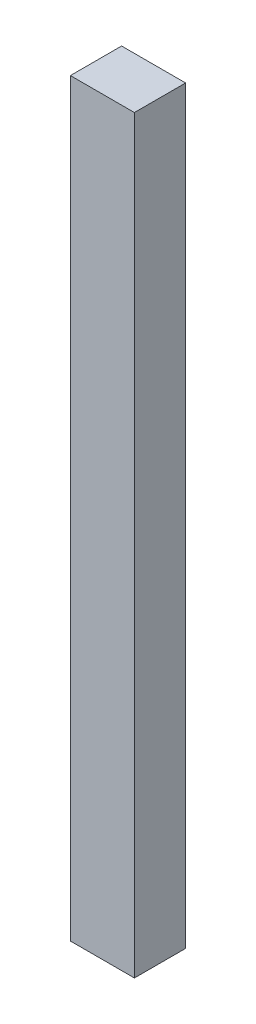
ISO-10303-21;
HEADER;
FILE_DESCRIPTION(('STEP AP214'),'2;1');
FILE_NAME('part.step','',(''),(''),'','','');
FILE_SCHEMA(('AUTOMOTIVE_DESIGN { 1 0 10303 214 1 1 1 1 }'));
ENDSEC;
DATA;
#1=APPLICATION_CONTEXT('core data for automotive mechanical design processes');
#2=APPLICATION_PROTOCOL_DEFINITION('international standard','automotive_design',2000,#1);
#3=PRODUCT_CONTEXT('',#1,'mechanical');
#4=PRODUCT('Part','Part','',(#3));
#5=PRODUCT_RELATED_PRODUCT_CATEGORY('part','',(#4));
#6=PRODUCT_DEFINITION_FORMATION('','',#4);
#7=PRODUCT_DEFINITION_CONTEXT('part definition',#1,'design');
#8=PRODUCT_DEFINITION('design','',#6,#7);
#9=PRODUCT_DEFINITION_SHAPE('','',#8);
#10=(LENGTH_UNIT() NAMED_UNIT(*) SI_UNIT(.MILLI.,.METRE.));
#11=(NAMED_UNIT(*) PLANE_ANGLE_UNIT() SI_UNIT($,.RADIAN.));
#12=(NAMED_UNIT(*) SI_UNIT($,.STERADIAN.) SOLID_ANGLE_UNIT());
#13=UNCERTAINTY_MEASURE_WITH_UNIT(LENGTH_MEASURE(1.E-05),#10,'distance_accuracy_value','');
#14=(GEOMETRIC_REPRESENTATION_CONTEXT(3) GLOBAL_UNCERTAINTY_ASSIGNED_CONTEXT((#13)) GLOBAL_UNIT_ASSIGNED_CONTEXT((#10,
#11,#12)) REPRESENTATION_CONTEXT('',''));
#15=CARTESIAN_POINT('',(0.,0.,0.));
#16=DIRECTION('',(0.,0.,1.));
#17=DIRECTION('',(1.,0.,0.));
#18=AXIS2_PLACEMENT_3D('',#15,#16,#17);
#19=CARTESIAN_POINT('',(-23.5,187.453124237433,0.));
#20=DIRECTION('',(-1.,0.,0.));
#21=DIRECTION('',(0.,0.,1.));
#22=AXIS2_PLACEMENT_3D('',#19,#20,#21);
#23=PLANE('',#22);
#24=DIRECTION('',(0.,0.,1.));
#25=VECTOR('',#24,1.);
#26=CARTESIAN_POINT('',(-23.5,122.5,15.5));
#27=LINE('',#26,#25);
#28=CARTESIAN_POINT('',(-23.5,122.5,15.5));
#29=VERTEX_POINT('',#28);
#30=CARTESIAN_POINT('',(-23.5,122.5,19.5));
#31=VERTEX_POINT('',#30);
#32=EDGE_CURVE('E64',#29,#31,#27,.T.);
#33=ORIENTED_EDGE('',*,*,#32,.F.);
#34=DIRECTION('',(0.,-1.,0.));
#35=VECTOR('',#34,1.);
#36=CARTESIAN_POINT('',(-23.5,187.453124237433,15.5));
#37=LINE('',#36,#35);
#38=CARTESIAN_POINT('',(-23.5,181.05,15.5));
#39=VERTEX_POINT('',#38);
#40=EDGE_CURVE('E100',#39,#29,#37,.T.);
#41=ORIENTED_EDGE('',*,*,#40,.F.);
#42=DIRECTION('',(0.,0.,-1.));
#43=VECTOR('',#42,1.);
#44=CARTESIAN_POINT('',(-23.5,181.05,0.));
#45=LINE('',#44,#43);
#46=CARTESIAN_POINT('',(-23.5,181.05,19.5));
#47=VERTEX_POINT('',#46);
#48=EDGE_CURVE('E56',#47,#39,#45,.T.);
#49=ORIENTED_EDGE('',*,*,#48,.F.);
#50=DIRECTION('',(0.,-1.,0.));
#51=VECTOR('',#50,1.);
#52=CARTESIAN_POINT('',(-23.5,187.453124237433,19.5));
#53=LINE('',#52,#51);
#54=EDGE_CURVE('E50',#47,#31,#53,.T.);
#55=ORIENTED_EDGE('',*,*,#54,.T.);
#56=EDGE_LOOP('',(#33,#41,#49,#55));
#57=FACE_BOUND('',#56,.T.);
#58=ADVANCED_FACE('F46',(#57),#23,.F.);
#59=CARTESIAN_POINT('',(0.,187.453124237433,15.5));
#60=DIRECTION('',(0.,0.,-1.));
#61=DIRECTION('',(-1.,0.,0.));
#62=AXIS2_PLACEMENT_3D('',#59,#60,#61);
#63=PLANE('',#62);
#64=ORIENTED_EDGE('',*,*,#40,.T.);
#65=DIRECTION('',(1.,0.,0.));
#66=VECTOR('',#65,1.);
#67=CARTESIAN_POINT('',(-28.5,122.5,15.5));
#68=LINE('',#67,#66);
#69=CARTESIAN_POINT('',(-28.5,122.5,15.5));
#70=VERTEX_POINT('',#69);
#71=EDGE_CURVE('E88',#70,#29,#68,.T.);
#72=ORIENTED_EDGE('',*,*,#71,.F.);
#73=DIRECTION('',(0.,-1.,0.));
#74=VECTOR('',#73,1.);
#75=CARTESIAN_POINT('',(-28.5,187.453124237433,15.5));
#76=LINE('',#75,#74);
#77=CARTESIAN_POINT('',(-28.5,181.05,15.5));
#78=VERTEX_POINT('',#77);
#79=EDGE_CURVE('E109',#78,#70,#76,.T.);
#80=ORIENTED_EDGE('',*,*,#79,.F.);
#81=DIRECTION('',(1.,0.,0.));
#82=VECTOR('',#81,1.);
#83=CARTESIAN_POINT('',(0.,181.05,15.5));
#84=LINE('',#83,#82);
#85=EDGE_CURVE('E107',#78,#39,#84,.T.);
#86=ORIENTED_EDGE('',*,*,#85,.T.);
#87=EDGE_LOOP('',(#64,#72,#80,#86));
#88=FACE_BOUND('',#87,.T.);
#89=ADVANCED_FACE('F105',(#88),#63,.T.);
#90=CARTESIAN_POINT('',(-28.5,187.453124237433,0.));
#91=DIRECTION('',(1.,0.,0.));
#92=DIRECTION('',(0.,0.,-1.));
#93=AXIS2_PLACEMENT_3D('',#90,#91,#92);
#94=PLANE('',#93);
#95=DIRECTION('',(0.,0.,-1.));
#96=VECTOR('',#95,1.);
#97=CARTESIAN_POINT('',(-28.5,122.5,19.5));
#98=LINE('',#97,#96);
#99=CARTESIAN_POINT('',(-28.5,122.5,19.5));
#100=VERTEX_POINT('',#99);
#101=EDGE_CURVE('E91',#100,#70,#98,.T.);
#102=ORIENTED_EDGE('',*,*,#101,.F.);
#103=DIRECTION('',(0.,-1.,0.));
#104=VECTOR('',#103,1.);
#105=CARTESIAN_POINT('',(-28.5,187.453124237433,19.5));
#106=LINE('',#105,#104);
#107=CARTESIAN_POINT('',(-28.5,181.05,19.5));
#108=VERTEX_POINT('',#107);
#109=EDGE_CURVE('E113',#108,#100,#106,.T.);
#110=ORIENTED_EDGE('',*,*,#109,.F.);
#111=DIRECTION('',(0.,0.,1.));
#112=VECTOR('',#111,1.);
#113=CARTESIAN_POINT('',(-28.5,181.05,0.));
#114=LINE('',#113,#112);
#115=EDGE_CURVE('E11',#78,#108,#114,.T.);
#116=ORIENTED_EDGE('',*,*,#115,.F.);
#117=ORIENTED_EDGE('',*,*,#79,.T.);
#118=EDGE_LOOP('',(#102,#110,#116,#117));
#119=FACE_BOUND('',#118,.T.);
#120=ADVANCED_FACE('F136',(#119),#94,.F.);
#121=CARTESIAN_POINT('',(0.,187.453124237433,19.5));
#122=DIRECTION('',(0.,0.,-1.));
#123=DIRECTION('',(-1.,0.,0.));
#124=AXIS2_PLACEMENT_3D('',#121,#122,#123);
#125=PLANE('',#124);
#126=DIRECTION('',(-1.,0.,0.));
#127=VECTOR('',#126,1.);
#128=CARTESIAN_POINT('',(-23.5,122.5,19.5));
#129=LINE('',#128,#127);
#130=EDGE_CURVE('E103',#31,#100,#129,.T.);
#131=ORIENTED_EDGE('',*,*,#130,.F.);
#132=ORIENTED_EDGE('',*,*,#54,.F.);
#133=DIRECTION('',(1.,0.,0.));
#134=VECTOR('',#133,1.);
#135=CARTESIAN_POINT('',(0.,181.05,19.5));
#136=LINE('',#135,#134);
#137=EDGE_CURVE('E118',#108,#47,#136,.T.);
#138=ORIENTED_EDGE('',*,*,#137,.F.);
#139=ORIENTED_EDGE('',*,*,#109,.T.);
#140=EDGE_LOOP('',(#131,#132,#138,#139));
#141=FACE_BOUND('',#140,.T.);
#142=ADVANCED_FACE('F138',(#141),#125,.F.);
#143=CARTESIAN_POINT('',(0.,181.05,0.));
#144=DIRECTION('',(0.,1.,0.));
#145=DIRECTION('',(0.,0.,1.));
#146=AXIS2_PLACEMENT_3D('',#143,#144,#145);
#147=PLANE('',#146);
#148=ORIENTED_EDGE('',*,*,#137,.T.);
#149=ORIENTED_EDGE('',*,*,#48,.T.);
#150=ORIENTED_EDGE('',*,*,#85,.F.);
#151=ORIENTED_EDGE('',*,*,#115,.T.);
#152=EDGE_LOOP('',(#148,#149,#150,#151));
#153=FACE_BOUND('',#152,.T.);
#154=ADVANCED_FACE('F48',(#153),#147,.T.);
#155=CARTESIAN_POINT('',(0.,122.5,0.));
#156=DIRECTION('',(0.,-1.,0.));
#157=DIRECTION('',(0.,0.,-1.));
#158=AXIS2_PLACEMENT_3D('',#155,#156,#157);
#159=PLANE('',#158);
#160=ORIENTED_EDGE('',*,*,#71,.T.);
#161=ORIENTED_EDGE('',*,*,#32,.T.);
#162=ORIENTED_EDGE('',*,*,#130,.T.);
#163=ORIENTED_EDGE('',*,*,#101,.T.);
#164=EDGE_LOOP('',(#160,#161,#162,#163));
#165=FACE_BOUND('',#164,.T.);
#166=ADVANCED_FACE('F89',(#165),#159,.T.);
#167=CLOSED_SHELL('',(#58,#89,#120,#142,#154,#166));
#168=MANIFOLD_SOLID_BREP('B2',#167);
#169=ADVANCED_BREP_SHAPE_REPRESENTATION('',(#18,#168),#14);
#170=SHAPE_DEFINITION_REPRESENTATION(#9,#169);
ENDSEC;
END-ISO-10303-21;
